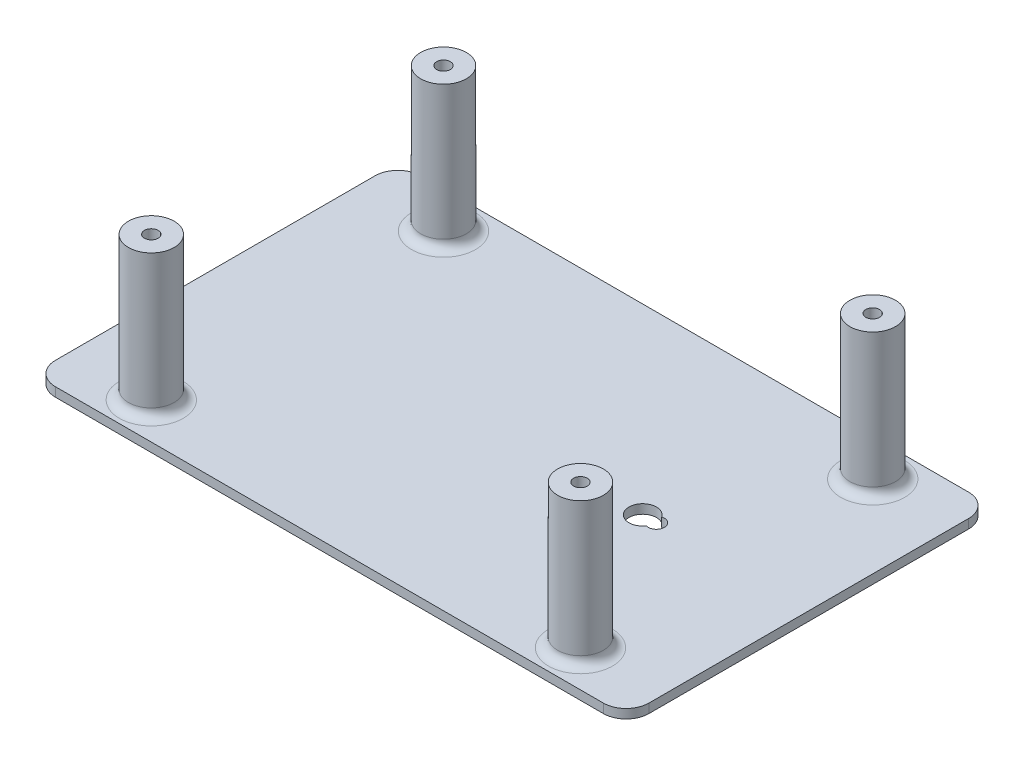
ISO-10303-21;
HEADER;
FILE_DESCRIPTION(('STEP AP214'),'2;1');
FILE_NAME('part.step','',(''),(''),'','','');
FILE_SCHEMA(('AUTOMOTIVE_DESIGN { 1 0 10303 214 1 1 1 1 }'));
ENDSEC;
DATA;
#1=APPLICATION_CONTEXT('core data for automotive mechanical design processes');
#2=APPLICATION_PROTOCOL_DEFINITION('international standard','automotive_design',2000,#1);
#3=PRODUCT_CONTEXT('',#1,'mechanical');
#4=PRODUCT('Part','Part','',(#3));
#5=PRODUCT_RELATED_PRODUCT_CATEGORY('part','',(#4));
#6=PRODUCT_DEFINITION_FORMATION('','',#4);
#7=PRODUCT_DEFINITION_CONTEXT('part definition',#1,'design');
#8=PRODUCT_DEFINITION('design','',#6,#7);
#9=PRODUCT_DEFINITION_SHAPE('','',#8);
#10=(LENGTH_UNIT() NAMED_UNIT(*) SI_UNIT(.MILLI.,.METRE.));
#11=(NAMED_UNIT(*) PLANE_ANGLE_UNIT() SI_UNIT($,.RADIAN.));
#12=(NAMED_UNIT(*) SI_UNIT($,.STERADIAN.) SOLID_ANGLE_UNIT());
#13=UNCERTAINTY_MEASURE_WITH_UNIT(LENGTH_MEASURE(1.E-05),#10,'distance_accuracy_value','');
#14=(GEOMETRIC_REPRESENTATION_CONTEXT(3) GLOBAL_UNCERTAINTY_ASSIGNED_CONTEXT((#13)) GLOBAL_UNIT_ASSIGNED_CONTEXT((#10,
#11,#12)) REPRESENTATION_CONTEXT('',''));
#15=CARTESIAN_POINT('',(0.,0.,0.));
#16=DIRECTION('',(0.,0.,1.));
#17=DIRECTION('',(1.,0.,0.));
#18=AXIS2_PLACEMENT_3D('',#15,#16,#17);
#19=CARTESIAN_POINT('',(-46.9999999999968,0.,32.0000000000053));
#20=DIRECTION('',(0.,1.,0.));
#21=DIRECTION('',(0.,0.,1.));
#22=AXIS2_PLACEMENT_3D('',#19,#20,#21);
#23=CYLINDRICAL_SURFACE('',#22,3.25);
#24=CARTESIAN_POINT('',(-46.9999999999968,2.,32.0000000000053));
#25=DIRECTION('',(0.,-1.,0.));
#26=DIRECTION('',(0.,0.,-1.));
#27=AXIS2_PLACEMENT_3D('',#24,#25,#26);
#28=CIRCLE('',#27,3.25);
#29=CARTESIAN_POINT('',(-46.9999999999968,2.,28.7500000000053));
#30=VERTEX_POINT('',#29);
#31=EDGE_CURVE('E273',#30,#30,#28,.T.);
#32=ORIENTED_EDGE('',*,*,#31,.T.);
#33=EDGE_LOOP('',(#32));
#34=FACE_BOUND('',#33,.T.);
#35=CARTESIAN_POINT('',(-46.9999999999968,18.4,32.0000000000053));
#36=DIRECTION('',(0.,1.,0.));
#37=DIRECTION('',(0.,0.,1.));
#38=AXIS2_PLACEMENT_3D('',#35,#36,#37);
#39=CIRCLE('',#38,3.25);
#40=CARTESIAN_POINT('',(-46.9999999999968,18.4,35.2500000000053));
#41=VERTEX_POINT('',#40);
#42=EDGE_CURVE('E255',#41,#41,#39,.F.);
#43=ORIENTED_EDGE('',*,*,#42,.F.);
#44=EDGE_LOOP('',(#43));
#45=FACE_BOUND('',#44,.T.);
#46=ADVANCED_FACE('F34',(#34,#45),#23,.F.);
#47=CARTESIAN_POINT('',(47.0000000000003,0.,32.0000000000053));
#48=DIRECTION('',(0.,1.,0.));
#49=DIRECTION('',(0.,0.,1.));
#50=AXIS2_PLACEMENT_3D('',#47,#48,#49);
#51=CYLINDRICAL_SURFACE('',#50,3.25);
#52=CARTESIAN_POINT('',(47.0000000000003,2.,32.0000000000053));
#53=DIRECTION('',(0.,-1.,0.));
#54=DIRECTION('',(0.,0.,-1.));
#55=AXIS2_PLACEMENT_3D('',#52,#53,#54);
#56=CIRCLE('',#55,3.25);
#57=CARTESIAN_POINT('',(47.0000000000003,2.,28.7500000000053));
#58=VERTEX_POINT('',#57);
#59=EDGE_CURVE('E270',#58,#58,#56,.T.);
#60=ORIENTED_EDGE('',*,*,#59,.T.);
#61=EDGE_LOOP('',(#60));
#62=FACE_BOUND('',#61,.T.);
#63=CARTESIAN_POINT('',(47.0000000000003,18.4,32.0000000000053));
#64=DIRECTION('',(0.,1.,0.));
#65=DIRECTION('',(0.,0.,1.));
#66=AXIS2_PLACEMENT_3D('',#63,#64,#65);
#67=CIRCLE('',#66,3.25);
#68=CARTESIAN_POINT('',(47.0000000000003,18.4,35.2500000000053));
#69=VERTEX_POINT('',#68);
#70=EDGE_CURVE('E252',#69,#69,#67,.F.);
#71=ORIENTED_EDGE('',*,*,#70,.F.);
#72=EDGE_LOOP('',(#71));
#73=FACE_BOUND('',#72,.T.);
#74=ADVANCED_FACE('F346',(#62,#73),#51,.F.);
#75=CARTESIAN_POINT('',(47.0000000000003,0.,-32.0000000000053));
#76=DIRECTION('',(0.,1.,0.));
#77=DIRECTION('',(0.,0.,1.));
#78=AXIS2_PLACEMENT_3D('',#75,#76,#77);
#79=CYLINDRICAL_SURFACE('',#78,3.25);
#80=CARTESIAN_POINT('',(47.0000000000003,2.,-32.0000000000053));
#81=DIRECTION('',(0.,-1.,0.));
#82=DIRECTION('',(0.,0.,-1.));
#83=AXIS2_PLACEMENT_3D('',#80,#81,#82);
#84=CIRCLE('',#83,3.25);
#85=CARTESIAN_POINT('',(47.0000000000003,2.,-35.2500000000053));
#86=VERTEX_POINT('',#85);
#87=EDGE_CURVE('E11',#86,#86,#84,.T.);
#88=ORIENTED_EDGE('',*,*,#87,.T.);
#89=EDGE_LOOP('',(#88));
#90=FACE_BOUND('',#89,.T.);
#91=CARTESIAN_POINT('',(47.0000000000003,18.4,-32.0000000000053));
#92=DIRECTION('',(0.,1.,0.));
#93=DIRECTION('',(0.,0.,1.));
#94=AXIS2_PLACEMENT_3D('',#91,#92,#93);
#95=CIRCLE('',#94,3.25);
#96=CARTESIAN_POINT('',(47.0000000000003,18.4,-28.7500000000053));
#97=VERTEX_POINT('',#96);
#98=EDGE_CURVE('E249',#97,#97,#95,.F.);
#99=ORIENTED_EDGE('',*,*,#98,.F.);
#100=EDGE_LOOP('',(#99));
#101=FACE_BOUND('',#100,.T.);
#102=ADVANCED_FACE('F342',(#90,#101),#79,.F.);
#103=CARTESIAN_POINT('',(-46.9999999999968,0.,-32.0000000000053));
#104=DIRECTION('',(0.,1.,0.));
#105=DIRECTION('',(0.,0.,1.));
#106=AXIS2_PLACEMENT_3D('',#103,#104,#105);
#107=CYLINDRICAL_SURFACE('',#106,3.25);
#108=CARTESIAN_POINT('',(-46.9999999999968,2.,-32.0000000000053));
#109=DIRECTION('',(0.,-1.,0.));
#110=DIRECTION('',(0.,0.,-1.));
#111=AXIS2_PLACEMENT_3D('',#108,#109,#110);
#112=CIRCLE('',#111,3.25);
#113=CARTESIAN_POINT('',(-46.9999999999968,2.,-35.2500000000053));
#114=VERTEX_POINT('',#113);
#115=EDGE_CURVE('E42',#114,#114,#112,.T.);
#116=ORIENTED_EDGE('',*,*,#115,.T.);
#117=EDGE_LOOP('',(#116));
#118=FACE_BOUND('',#117,.T.);
#119=CARTESIAN_POINT('',(-46.9999999999968,18.4,-32.0000000000053));
#120=DIRECTION('',(0.,1.,0.));
#121=DIRECTION('',(0.,0.,1.));
#122=AXIS2_PLACEMENT_3D('',#119,#120,#121);
#123=CIRCLE('',#122,3.25);
#124=CARTESIAN_POINT('',(-46.9999999999968,18.4,-28.7500000000053));
#125=VERTEX_POINT('',#124);
#126=EDGE_CURVE('E246',#125,#125,#123,.F.);
#127=ORIENTED_EDGE('',*,*,#126,.F.);
#128=EDGE_LOOP('',(#127));
#129=FACE_BOUND('',#128,.T.);
#130=ADVANCED_FACE('F278',(#118,#129),#107,.F.);
#131=CARTESIAN_POINT('',(60.0000000000006,2.,-34.999999999996));
#132=DIRECTION('',(0.,-1.,0.));
#133=DIRECTION('',(0.,0.,-1.));
#134=AXIS2_PLACEMENT_3D('',#131,#132,#133);
#135=PLANE('',#134);
#136=CARTESIAN_POINT('',(28.6224498233947,2.,0.));
#137=DIRECTION('',(0.,-1.,0.));
#138=DIRECTION('',(0.,0.,-1.));
#139=AXIS2_PLACEMENT_3D('',#136,#137,#138);
#140=CIRCLE('',#139,3.);
#141=CARTESIAN_POINT('',(31.112033156728,2.,1.67391004130715));
#142=VERTEX_POINT('',#141);
#143=CARTESIAN_POINT('',(31.112033156728,2.,-1.67391004130715));
#144=VERTEX_POINT('',#143);
#145=EDGE_CURVE('E113',#142,#144,#140,.T.);
#146=ORIENTED_EDGE('',*,*,#145,.T.);
#147=CARTESIAN_POINT('',(31.6224498233947,2.,0.));
#148=DIRECTION('',(0.,-1.,0.));
#149=DIRECTION('',(0.,0.,-1.));
#150=AXIS2_PLACEMENT_3D('',#147,#148,#149);
#151=CIRCLE('',#150,1.75);
#152=EDGE_CURVE('E111',#144,#142,#151,.T.);
#153=ORIENTED_EDGE('',*,*,#152,.T.);
#154=EDGE_LOOP('',(#146,#153));
#155=FACE_BOUND('',#154,.T.);
#156=CARTESIAN_POINT('',(-46.9999999999968,2.,32.0000000000053));
#157=DIRECTION('',(0.,-1.,0.));
#158=DIRECTION('',(0.,0.,-1.));
#159=AXIS2_PLACEMENT_3D('',#156,#157,#158);
#160=CIRCLE('',#159,7.);
#161=CARTESIAN_POINT('',(-46.9999999999968,2.,25.0000000000053));
#162=VERTEX_POINT('',#161);
#163=EDGE_CURVE('E234',#162,#162,#160,.T.);
#164=ORIENTED_EDGE('',*,*,#163,.T.);
#165=EDGE_LOOP('',(#164));
#166=FACE_BOUND('',#165,.T.);
#167=CARTESIAN_POINT('',(47.0000000000003,2.,32.0000000000053));
#168=DIRECTION('',(0.,-1.,0.));
#169=DIRECTION('',(0.,0.,-1.));
#170=AXIS2_PLACEMENT_3D('',#167,#168,#169);
#171=CIRCLE('',#170,7.);
#172=CARTESIAN_POINT('',(47.0000000000003,2.,25.0000000000053));
#173=VERTEX_POINT('',#172);
#174=EDGE_CURVE('E231',#173,#173,#171,.T.);
#175=ORIENTED_EDGE('',*,*,#174,.T.);
#176=EDGE_LOOP('',(#175));
#177=FACE_BOUND('',#176,.T.);
#178=CARTESIAN_POINT('',(47.0000000000003,2.,-32.0000000000053));
#179=DIRECTION('',(0.,-1.,0.));
#180=DIRECTION('',(0.,0.,-1.));
#181=AXIS2_PLACEMENT_3D('',#178,#179,#180);
#182=CIRCLE('',#181,7.);
#183=CARTESIAN_POINT('',(47.0000000000003,2.,-39.0000000000053));
#184=VERTEX_POINT('',#183);
#185=EDGE_CURVE('E228',#184,#184,#182,.T.);
#186=ORIENTED_EDGE('',*,*,#185,.T.);
#187=EDGE_LOOP('',(#186));
#188=FACE_BOUND('',#187,.T.);
#189=CARTESIAN_POINT('',(-46.9999999999968,2.,-32.0000000000053));
#190=DIRECTION('',(0.,-1.,0.));
#191=DIRECTION('',(0.,0.,-1.));
#192=AXIS2_PLACEMENT_3D('',#189,#190,#191);
#193=CIRCLE('',#192,7.);
#194=CARTESIAN_POINT('',(-46.9999999999968,2.,-39.0000000000053));
#195=VERTEX_POINT('',#194);
#196=EDGE_CURVE('E225',#195,#195,#193,.T.);
#197=ORIENTED_EDGE('',*,*,#196,.T.);
#198=EDGE_LOOP('',(#197));
#199=FACE_BOUND('',#198,.T.);
#200=CARTESIAN_POINT('',(60.0000000000006,2.,-34.999999999996));
#201=DIRECTION('',(0.,1.,0.));
#202=DIRECTION('',(0.,0.,-1.));
#203=AXIS2_PLACEMENT_3D('',#200,#201,#202);
#204=CIRCLE('',#203,5.);
#205=CARTESIAN_POINT('',(65.0000000000006,2.,-34.999999999996));
#206=VERTEX_POINT('',#205);
#207=CARTESIAN_POINT('',(60.0000000000006,2.,-39.999999999996));
#208=VERTEX_POINT('',#207);
#209=EDGE_CURVE('E165',#206,#208,#204,.T.);
#210=ORIENTED_EDGE('',*,*,#209,.T.);
#211=DIRECTION('',(-1.,0.,0.));
#212=VECTOR('',#211,1.);
#213=CARTESIAN_POINT('',(-59.9999999999971,2.,-39.999999999996));
#214=LINE('',#213,#212);
#215=CARTESIAN_POINT('',(-59.9999999999971,2.,-39.999999999996));
#216=VERTEX_POINT('',#215);
#217=EDGE_CURVE('E168',#208,#216,#214,.T.);
#218=ORIENTED_EDGE('',*,*,#217,.T.);
#219=CARTESIAN_POINT('',(-59.9999999999971,2.,-34.999999999996));
#220=DIRECTION('',(0.,1.,0.));
#221=DIRECTION('',(0.,0.,1.));
#222=AXIS2_PLACEMENT_3D('',#219,#220,#221);
#223=CIRCLE('',#222,5.);
#224=CARTESIAN_POINT('',(-64.9999999999971,2.,-34.999999999996));
#225=VERTEX_POINT('',#224);
#226=EDGE_CURVE('E171',#216,#225,#223,.T.);
#227=ORIENTED_EDGE('',*,*,#226,.T.);
#228=DIRECTION('',(0.,0.,1.));
#229=VECTOR('',#228,1.);
#230=CARTESIAN_POINT('',(-64.9999999999971,2.,34.999999999996));
#231=LINE('',#230,#229);
#232=CARTESIAN_POINT('',(-64.9999999999971,2.,34.999999999996));
#233=VERTEX_POINT('',#232);
#234=EDGE_CURVE('E173',#225,#233,#231,.T.);
#235=ORIENTED_EDGE('',*,*,#234,.T.);
#236=CARTESIAN_POINT('',(-59.9999999999971,2.,34.999999999996));
#237=DIRECTION('',(0.,1.,0.));
#238=DIRECTION('',(0.,0.,-1.));
#239=AXIS2_PLACEMENT_3D('',#236,#237,#238);
#240=CIRCLE('',#239,5.);
#241=CARTESIAN_POINT('',(-59.9999999999971,2.,39.999999999996));
#242=VERTEX_POINT('',#241);
#243=EDGE_CURVE('E175',#233,#242,#240,.T.);
#244=ORIENTED_EDGE('',*,*,#243,.T.);
#245=DIRECTION('',(1.,0.,0.));
#246=VECTOR('',#245,1.);
#247=CARTESIAN_POINT('',(60.0000000000006,2.,39.999999999996));
#248=LINE('',#247,#246);
#249=CARTESIAN_POINT('',(60.0000000000006,2.,39.999999999996));
#250=VERTEX_POINT('',#249);
#251=EDGE_CURVE('E177',#242,#250,#248,.T.);
#252=ORIENTED_EDGE('',*,*,#251,.T.);
#253=CARTESIAN_POINT('',(60.0000000000006,2.,34.999999999996));
#254=DIRECTION('',(0.,1.,0.));
#255=DIRECTION('',(0.,0.,-1.));
#256=AXIS2_PLACEMENT_3D('',#253,#254,#255);
#257=CIRCLE('',#256,5.);
#258=CARTESIAN_POINT('',(65.0000000000006,2.,34.999999999996));
#259=VERTEX_POINT('',#258);
#260=EDGE_CURVE('E179',#250,#259,#257,.T.);
#261=ORIENTED_EDGE('',*,*,#260,.T.);
#262=DIRECTION('',(0.,0.,-1.));
#263=VECTOR('',#262,1.);
#264=CARTESIAN_POINT('',(65.0000000000006,2.,-34.999999999996));
#265=LINE('',#264,#263);
#266=EDGE_CURVE('E181',#259,#206,#265,.T.);
#267=ORIENTED_EDGE('',*,*,#266,.T.);
#268=EDGE_LOOP('',(#210,#218,#227,#235,#244,#252,#261,#267));
#269=FACE_BOUND('',#268,.T.);
#270=ADVANCED_FACE('F332',(#155,#166,#177,#188,#199,#269),#135,.F.);
#271=CARTESIAN_POINT('',(60.0000000000006,2.,-34.999999999996));
#272=DIRECTION('',(0.,-1.,0.));
#273=DIRECTION('',(0.,0.,-1.));
#274=AXIS2_PLACEMENT_3D('',#271,#272,#273);
#275=CYLINDRICAL_SURFACE('',#274,5.);
#276=CARTESIAN_POINT('',(60.0000000000006,0.,-34.999999999996));
#277=DIRECTION('',(0.,1.,0.));
#278=DIRECTION('',(0.,0.,-1.));
#279=AXIS2_PLACEMENT_3D('',#276,#277,#278);
#280=CIRCLE('',#279,5.);
#281=CARTESIAN_POINT('',(65.0000000000006,0.,-34.999999999996));
#282=VERTEX_POINT('',#281);
#283=CARTESIAN_POINT('',(60.0000000000006,0.,-39.999999999996));
#284=VERTEX_POINT('',#283);
#285=EDGE_CURVE('E164',#282,#284,#280,.T.);
#286=ORIENTED_EDGE('',*,*,#285,.T.);
#287=DIRECTION('',(0.,-1.,0.));
#288=VECTOR('',#287,1.);
#289=CARTESIAN_POINT('',(60.0000000000006,2.,-39.999999999996));
#290=LINE('',#289,#288);
#291=EDGE_CURVE('E219',#208,#284,#290,.T.);
#292=ORIENTED_EDGE('',*,*,#291,.F.);
#293=ORIENTED_EDGE('',*,*,#209,.F.);
#294=DIRECTION('',(0.,-1.,0.));
#295=VECTOR('',#294,1.);
#296=CARTESIAN_POINT('',(65.0000000000006,2.,-34.999999999996));
#297=LINE('',#296,#295);
#298=EDGE_CURVE('E183',#206,#282,#297,.T.);
#299=ORIENTED_EDGE('',*,*,#298,.T.);
#300=EDGE_LOOP('',(#286,#292,#293,#299));
#301=FACE_BOUND('',#300,.T.);
#302=ADVANCED_FACE('F300',(#301),#275,.T.);
#303=CARTESIAN_POINT('',(-59.9999999999971,2.,-39.999999999996));
#304=DIRECTION('',(0.,0.,1.));
#305=DIRECTION('',(1.,0.,0.));
#306=AXIS2_PLACEMENT_3D('',#303,#304,#305);
#307=PLANE('',#306);
#308=DIRECTION('',(-1.,0.,0.));
#309=VECTOR('',#308,1.);
#310=CARTESIAN_POINT('',(-59.9999999999971,0.,-39.999999999996));
#311=LINE('',#310,#309);
#312=CARTESIAN_POINT('',(-59.9999999999971,0.,-39.999999999996));
#313=VERTEX_POINT('',#312);
#314=EDGE_CURVE('E186',#284,#313,#311,.T.);
#315=ORIENTED_EDGE('',*,*,#314,.T.);
#316=DIRECTION('',(0.,-1.,0.));
#317=VECTOR('',#316,1.);
#318=CARTESIAN_POINT('',(-59.9999999999971,2.,-39.999999999996));
#319=LINE('',#318,#317);
#320=EDGE_CURVE('E216',#216,#313,#319,.T.);
#321=ORIENTED_EDGE('',*,*,#320,.F.);
#322=ORIENTED_EDGE('',*,*,#217,.F.);
#323=ORIENTED_EDGE('',*,*,#291,.T.);
#324=EDGE_LOOP('',(#315,#321,#322,#323));
#325=FACE_BOUND('',#324,.T.);
#326=ADVANCED_FACE('F330',(#325),#307,.F.);
#327=CARTESIAN_POINT('',(-59.9999999999971,2.,-34.999999999996));
#328=DIRECTION('',(0.,-1.,0.));
#329=DIRECTION('',(0.,0.,-1.));
#330=AXIS2_PLACEMENT_3D('',#327,#328,#329);
#331=CYLINDRICAL_SURFACE('',#330,5.);
#332=CARTESIAN_POINT('',(-59.9999999999971,0.,-34.999999999996));
#333=DIRECTION('',(0.,1.,0.));
#334=DIRECTION('',(0.,0.,1.));
#335=AXIS2_PLACEMENT_3D('',#332,#333,#334);
#336=CIRCLE('',#335,5.);
#337=CARTESIAN_POINT('',(-64.9999999999971,0.,-34.999999999996));
#338=VERTEX_POINT('',#337);
#339=EDGE_CURVE('E188',#313,#338,#336,.T.);
#340=ORIENTED_EDGE('',*,*,#339,.T.);
#341=DIRECTION('',(0.,-1.,0.));
#342=VECTOR('',#341,1.);
#343=CARTESIAN_POINT('',(-64.9999999999971,2.,-34.999999999996));
#344=LINE('',#343,#342);
#345=EDGE_CURVE('E213',#225,#338,#344,.T.);
#346=ORIENTED_EDGE('',*,*,#345,.F.);
#347=ORIENTED_EDGE('',*,*,#226,.F.);
#348=ORIENTED_EDGE('',*,*,#320,.T.);
#349=EDGE_LOOP('',(#340,#346,#347,#348));
#350=FACE_BOUND('',#349,.T.);
#351=ADVANCED_FACE('F326',(#350),#331,.T.);
#352=CARTESIAN_POINT('',(-64.9999999999971,2.,34.999999999996));
#353=DIRECTION('',(1.,0.,0.));
#354=DIRECTION('',(0.,0.,-1.));
#355=AXIS2_PLACEMENT_3D('',#352,#353,#354);
#356=PLANE('',#355);
#357=DIRECTION('',(0.,0.,1.));
#358=VECTOR('',#357,1.);
#359=CARTESIAN_POINT('',(-64.9999999999971,0.,34.999999999996));
#360=LINE('',#359,#358);
#361=CARTESIAN_POINT('',(-64.9999999999971,0.,34.999999999996));
#362=VERTEX_POINT('',#361);
#363=EDGE_CURVE('E190',#338,#362,#360,.T.);
#364=ORIENTED_EDGE('',*,*,#363,.T.);
#365=DIRECTION('',(0.,-1.,0.));
#366=VECTOR('',#365,1.);
#367=CARTESIAN_POINT('',(-64.9999999999971,2.,34.999999999996));
#368=LINE('',#367,#366);
#369=EDGE_CURVE('E210',#233,#362,#368,.T.);
#370=ORIENTED_EDGE('',*,*,#369,.F.);
#371=ORIENTED_EDGE('',*,*,#234,.F.);
#372=ORIENTED_EDGE('',*,*,#345,.T.);
#373=EDGE_LOOP('',(#364,#370,#371,#372));
#374=FACE_BOUND('',#373,.T.);
#375=ADVANCED_FACE('F323',(#374),#356,.F.);
#376=CARTESIAN_POINT('',(-59.9999999999971,2.,34.999999999996));
#377=DIRECTION('',(0.,-1.,0.));
#378=DIRECTION('',(0.,0.,-1.));
#379=AXIS2_PLACEMENT_3D('',#376,#377,#378);
#380=CYLINDRICAL_SURFACE('',#379,5.);
#381=CARTESIAN_POINT('',(-59.9999999999971,0.,34.999999999996));
#382=DIRECTION('',(0.,1.,0.));
#383=DIRECTION('',(0.,0.,-1.));
#384=AXIS2_PLACEMENT_3D('',#381,#382,#383);
#385=CIRCLE('',#384,5.);
#386=CARTESIAN_POINT('',(-59.9999999999971,0.,39.999999999996));
#387=VERTEX_POINT('',#386);
#388=EDGE_CURVE('E192',#362,#387,#385,.T.);
#389=ORIENTED_EDGE('',*,*,#388,.T.);
#390=DIRECTION('',(0.,-1.,0.));
#391=VECTOR('',#390,1.);
#392=CARTESIAN_POINT('',(-59.9999999999971,2.,39.999999999996));
#393=LINE('',#392,#391);
#394=EDGE_CURVE('E207',#242,#387,#393,.T.);
#395=ORIENTED_EDGE('',*,*,#394,.F.);
#396=ORIENTED_EDGE('',*,*,#243,.F.);
#397=ORIENTED_EDGE('',*,*,#369,.T.);
#398=EDGE_LOOP('',(#389,#395,#396,#397));
#399=FACE_BOUND('',#398,.T.);
#400=ADVANCED_FACE('F319',(#399),#380,.T.);
#401=CARTESIAN_POINT('',(60.0000000000006,2.,39.999999999996));
#402=DIRECTION('',(0.,0.,-1.));
#403=DIRECTION('',(-1.,0.,0.));
#404=AXIS2_PLACEMENT_3D('',#401,#402,#403);
#405=PLANE('',#404);
#406=DIRECTION('',(1.,0.,0.));
#407=VECTOR('',#406,1.);
#408=CARTESIAN_POINT('',(60.0000000000006,0.,39.999999999996));
#409=LINE('',#408,#407);
#410=CARTESIAN_POINT('',(60.0000000000006,0.,39.999999999996));
#411=VERTEX_POINT('',#410);
#412=EDGE_CURVE('E194',#387,#411,#409,.T.);
#413=ORIENTED_EDGE('',*,*,#412,.T.);
#414=DIRECTION('',(0.,-1.,0.));
#415=VECTOR('',#414,1.);
#416=CARTESIAN_POINT('',(60.0000000000006,2.,39.999999999996));
#417=LINE('',#416,#415);
#418=EDGE_CURVE('E204',#250,#411,#417,.T.);
#419=ORIENTED_EDGE('',*,*,#418,.F.);
#420=ORIENTED_EDGE('',*,*,#251,.F.);
#421=ORIENTED_EDGE('',*,*,#394,.T.);
#422=EDGE_LOOP('',(#413,#419,#420,#421));
#423=FACE_BOUND('',#422,.T.);
#424=ADVANCED_FACE('F314',(#423),#405,.F.);
#425=CARTESIAN_POINT('',(60.0000000000006,2.,34.999999999996));
#426=DIRECTION('',(0.,-1.,0.));
#427=DIRECTION('',(0.,0.,-1.));
#428=AXIS2_PLACEMENT_3D('',#425,#426,#427);
#429=CYLINDRICAL_SURFACE('',#428,5.);
#430=CARTESIAN_POINT('',(60.0000000000006,0.,34.999999999996));
#431=DIRECTION('',(0.,1.,0.));
#432=DIRECTION('',(0.,0.,-1.));
#433=AXIS2_PLACEMENT_3D('',#430,#431,#432);
#434=CIRCLE('',#433,5.);
#435=CARTESIAN_POINT('',(65.0000000000006,0.,34.999999999996));
#436=VERTEX_POINT('',#435);
#437=EDGE_CURVE('E196',#411,#436,#434,.T.);
#438=ORIENTED_EDGE('',*,*,#437,.T.);
#439=DIRECTION('',(0.,-1.,0.));
#440=VECTOR('',#439,1.);
#441=CARTESIAN_POINT('',(65.0000000000006,2.,34.999999999996));
#442=LINE('',#441,#440);
#443=EDGE_CURVE('E201',#259,#436,#442,.T.);
#444=ORIENTED_EDGE('',*,*,#443,.F.);
#445=ORIENTED_EDGE('',*,*,#260,.F.);
#446=ORIENTED_EDGE('',*,*,#418,.T.);
#447=EDGE_LOOP('',(#438,#444,#445,#446));
#448=FACE_BOUND('',#447,.T.);
#449=ADVANCED_FACE('F308',(#448),#429,.T.);
#450=CARTESIAN_POINT('',(65.0000000000006,2.,-34.999999999996));
#451=DIRECTION('',(-1.,0.,0.));
#452=DIRECTION('',(0.,0.,1.));
#453=AXIS2_PLACEMENT_3D('',#450,#451,#452);
#454=PLANE('',#453);
#455=DIRECTION('',(0.,0.,-1.));
#456=VECTOR('',#455,1.);
#457=CARTESIAN_POINT('',(65.0000000000006,0.,-34.999999999996));
#458=LINE('',#457,#456);
#459=EDGE_CURVE('E169',#436,#282,#458,.T.);
#460=ORIENTED_EDGE('',*,*,#459,.T.);
#461=ORIENTED_EDGE('',*,*,#298,.F.);
#462=ORIENTED_EDGE('',*,*,#266,.F.);
#463=ORIENTED_EDGE('',*,*,#443,.T.);
#464=EDGE_LOOP('',(#460,#461,#462,#463));
#465=FACE_BOUND('',#464,.T.);
#466=ADVANCED_FACE('F290',(#465),#454,.F.);
#467=CARTESIAN_POINT('',(60.0000000000006,0.,-34.999999999996));
#468=DIRECTION('',(0.,-1.,0.));
#469=DIRECTION('',(0.,0.,-1.));
#470=AXIS2_PLACEMENT_3D('',#467,#468,#469);
#471=PLANE('',#470);
#472=CARTESIAN_POINT('',(31.6224498233947,0.,0.));
#473=DIRECTION('',(0.,-1.,0.));
#474=DIRECTION('',(0.,0.,-1.));
#475=AXIS2_PLACEMENT_3D('',#472,#473,#474);
#476=CIRCLE('',#475,1.75);
#477=CARTESIAN_POINT('',(31.112033156728,0.,-1.67391004130715));
#478=VERTEX_POINT('',#477);
#479=CARTESIAN_POINT('',(31.112033156728,0.,1.67391004130715));
#480=VERTEX_POINT('',#479);
#481=EDGE_CURVE('E56',#478,#480,#476,.T.);
#482=ORIENTED_EDGE('',*,*,#481,.F.);
#483=CARTESIAN_POINT('',(28.6224498233947,0.,0.));
#484=DIRECTION('',(0.,-1.,0.));
#485=DIRECTION('',(0.,0.,-1.));
#486=AXIS2_PLACEMENT_3D('',#483,#484,#485);
#487=CIRCLE('',#486,3.);
#488=EDGE_CURVE('E117',#480,#478,#487,.T.);
#489=ORIENTED_EDGE('',*,*,#488,.F.);
#490=EDGE_LOOP('',(#482,#489));
#491=FACE_BOUND('',#490,.T.);
#492=CARTESIAN_POINT('',(47.0000000000003,0.,32.0000000000053));
#493=DIRECTION('',(0.,-1.,0.));
#494=DIRECTION('',(0.,0.,-1.));
#495=AXIS2_PLACEMENT_3D('',#492,#493,#494);
#496=CIRCLE('',#495,5.25);
#497=CARTESIAN_POINT('',(47.0000000000003,0.,26.7500000000053));
#498=VERTEX_POINT('',#497);
#499=EDGE_CURVE('E267',#498,#498,#496,.F.);
#500=ORIENTED_EDGE('',*,*,#499,.T.);
#501=EDGE_LOOP('',(#500));
#502=FACE_BOUND('',#501,.T.);
#503=CARTESIAN_POINT('',(-46.9999999999968,0.,32.0000000000053));
#504=DIRECTION('',(0.,-1.,0.));
#505=DIRECTION('',(0.,0.,-1.));
#506=AXIS2_PLACEMENT_3D('',#503,#504,#505);
#507=CIRCLE('',#506,5.25);
#508=CARTESIAN_POINT('',(-46.9999999999968,0.,26.7500000000053));
#509=VERTEX_POINT('',#508);
#510=EDGE_CURVE('E264',#509,#509,#507,.F.);
#511=ORIENTED_EDGE('',*,*,#510,.T.);
#512=EDGE_LOOP('',(#511));
#513=FACE_BOUND('',#512,.T.);
#514=CARTESIAN_POINT('',(-46.9999999999968,0.,-32.0000000000053));
#515=DIRECTION('',(0.,-1.,0.));
#516=DIRECTION('',(0.,0.,-1.));
#517=AXIS2_PLACEMENT_3D('',#514,#515,#516);
#518=CIRCLE('',#517,5.25);
#519=CARTESIAN_POINT('',(-46.9999999999968,0.,-37.2500000000054));
#520=VERTEX_POINT('',#519);
#521=EDGE_CURVE('E261',#520,#520,#518,.F.);
#522=ORIENTED_EDGE('',*,*,#521,.T.);
#523=EDGE_LOOP('',(#522));
#524=FACE_BOUND('',#523,.T.);
#525=CARTESIAN_POINT('',(47.0000000000003,0.,-32.0000000000053));
#526=DIRECTION('',(0.,-1.,0.));
#527=DIRECTION('',(0.,0.,-1.));
#528=AXIS2_PLACEMENT_3D('',#525,#526,#527);
#529=CIRCLE('',#528,5.25);
#530=CARTESIAN_POINT('',(47.0000000000003,0.,-37.2500000000054));
#531=VERTEX_POINT('',#530);
#532=EDGE_CURVE('E258',#531,#531,#529,.F.);
#533=ORIENTED_EDGE('',*,*,#532,.T.);
#534=EDGE_LOOP('',(#533));
#535=FACE_BOUND('',#534,.T.);
#536=ORIENTED_EDGE('',*,*,#285,.F.);
#537=ORIENTED_EDGE('',*,*,#459,.F.);
#538=ORIENTED_EDGE('',*,*,#437,.F.);
#539=ORIENTED_EDGE('',*,*,#412,.F.);
#540=ORIENTED_EDGE('',*,*,#388,.F.);
#541=ORIENTED_EDGE('',*,*,#363,.F.);
#542=ORIENTED_EDGE('',*,*,#339,.F.);
#543=ORIENTED_EDGE('',*,*,#314,.F.);
#544=EDGE_LOOP('',(#536,#537,#538,#539,#540,#541,#542,#543));
#545=FACE_BOUND('',#544,.T.);
#546=ADVANCED_FACE('F121',(#491,#502,#513,#524,#535,#545),#471,.T.);
#547=CARTESIAN_POINT('',(-46.9999999999968,33.4,-32.0000000000053));
#548=DIRECTION('',(0.,1.,0.));
#549=DIRECTION('',(0.,0.,1.));
#550=AXIS2_PLACEMENT_3D('',#547,#548,#549);
#551=PLANE('',#550);
#552=CARTESIAN_POINT('',(-46.9999999999968,33.4,-32.0000000000053));
#553=DIRECTION('',(0.,1.,0.));
#554=DIRECTION('',(0.,0.,1.));
#555=AXIS2_PLACEMENT_3D('',#552,#553,#554);
#556=CIRCLE('',#555,5.);
#557=CARTESIAN_POINT('',(-46.9999999999968,33.4,-27.0000000000053));
#558=VERTEX_POINT('',#557);
#559=EDGE_CURVE('E161',#558,#558,#556,.T.);
#560=ORIENTED_EDGE('',*,*,#559,.T.);
#561=EDGE_LOOP('',(#560));
#562=FACE_BOUND('',#561,.T.);
#563=CARTESIAN_POINT('',(-46.9999999999968,33.4,-32.0000000000053));
#564=DIRECTION('',(0.,1.,0.));
#565=DIRECTION('',(0.,0.,1.));
#566=AXIS2_PLACEMENT_3D('',#563,#564,#565);
#567=CIRCLE('',#566,1.5);
#568=CARTESIAN_POINT('',(-46.9999999999968,33.4,-30.5000000000053));
#569=VERTEX_POINT('',#568);
#570=EDGE_CURVE('E144',#569,#569,#567,.T.);
#571=ORIENTED_EDGE('',*,*,#570,.F.);
#572=EDGE_LOOP('',(#571));
#573=FACE_BOUND('',#572,.T.);
#574=ADVANCED_FACE('F289',(#562,#573),#551,.T.);
#575=CARTESIAN_POINT('',(-46.9999999999968,33.4,-32.0000000000053));
#576=DIRECTION('',(0.,-1.,0.));
#577=DIRECTION('',(0.,0.,-1.));
#578=AXIS2_PLACEMENT_3D('',#575,#576,#577);
#579=CYLINDRICAL_SURFACE('',#578,5.);
#580=CARTESIAN_POINT('',(-46.9999999999968,4.,-32.0000000000053));
#581=DIRECTION('',(0.,-1.,0.));
#582=DIRECTION('',(0.,0.,-1.));
#583=AXIS2_PLACEMENT_3D('',#580,#581,#582);
#584=CIRCLE('',#583,5.);
#585=CARTESIAN_POINT('',(-46.9999999999968,4.,-37.0000000000053));
#586=VERTEX_POINT('',#585);
#587=EDGE_CURVE('E243',#586,#586,#584,.F.);
#588=ORIENTED_EDGE('',*,*,#587,.T.);
#589=EDGE_LOOP('',(#588));
#590=FACE_BOUND('',#589,.T.);
#591=ORIENTED_EDGE('',*,*,#559,.F.);
#592=EDGE_LOOP('',(#591));
#593=FACE_BOUND('',#592,.T.);
#594=ADVANCED_FACE('F359',(#590,#593),#579,.T.);
#595=CARTESIAN_POINT('',(47.0000000000003,33.4,32.0000000000053));
#596=DIRECTION('',(0.,1.,0.));
#597=DIRECTION('',(0.,0.,1.));
#598=AXIS2_PLACEMENT_3D('',#595,#596,#597);
#599=PLANE('',#598);
#600=CARTESIAN_POINT('',(47.0000000000003,33.4,32.0000000000053));
#601=DIRECTION('',(0.,1.,0.));
#602=DIRECTION('',(0.,0.,1.));
#603=AXIS2_PLACEMENT_3D('',#600,#601,#602);
#604=CIRCLE('',#603,5.);
#605=CARTESIAN_POINT('',(47.0000000000003,33.4,37.0000000000053));
#606=VERTEX_POINT('',#605);
#607=EDGE_CURVE('E158',#606,#606,#604,.T.);
#608=ORIENTED_EDGE('',*,*,#607,.T.);
#609=EDGE_LOOP('',(#608));
#610=FACE_BOUND('',#609,.T.);
#611=CARTESIAN_POINT('',(47.0000000000003,33.4,32.0000000000053));
#612=DIRECTION('',(0.,1.,0.));
#613=DIRECTION('',(0.,0.,1.));
#614=AXIS2_PLACEMENT_3D('',#611,#612,#613);
#615=CIRCLE('',#614,1.5);
#616=CARTESIAN_POINT('',(47.0000000000003,33.4,33.5000000000053));
#617=VERTEX_POINT('',#616);
#618=EDGE_CURVE('E132',#617,#617,#615,.T.);
#619=ORIENTED_EDGE('',*,*,#618,.F.);
#620=EDGE_LOOP('',(#619));
#621=FACE_BOUND('',#620,.T.);
#622=ADVANCED_FACE('F362',(#610,#621),#599,.T.);
#623=CARTESIAN_POINT('',(47.0000000000003,33.4,32.0000000000053));
#624=DIRECTION('',(0.,-1.,0.));
#625=DIRECTION('',(0.,0.,-1.));
#626=AXIS2_PLACEMENT_3D('',#623,#624,#625);
#627=CYLINDRICAL_SURFACE('',#626,5.);
#628=CARTESIAN_POINT('',(47.0000000000003,4.,32.0000000000053));
#629=DIRECTION('',(0.,-1.,0.));
#630=DIRECTION('',(0.,0.,-1.));
#631=AXIS2_PLACEMENT_3D('',#628,#629,#630);
#632=CIRCLE('',#631,5.);
#633=CARTESIAN_POINT('',(47.0000000000003,4.,27.0000000000053));
#634=VERTEX_POINT('',#633);
#635=EDGE_CURVE('E237',#634,#634,#632,.F.);
#636=ORIENTED_EDGE('',*,*,#635,.T.);
#637=EDGE_LOOP('',(#636));
#638=FACE_BOUND('',#637,.T.);
#639=ORIENTED_EDGE('',*,*,#607,.F.);
#640=EDGE_LOOP('',(#639));
#641=FACE_BOUND('',#640,.T.);
#642=ADVANCED_FACE('F367',(#638,#641),#627,.T.);
#643=CARTESIAN_POINT('',(47.0000000000003,33.4,-32.0000000000053));
#644=DIRECTION('',(0.,1.,0.));
#645=DIRECTION('',(0.,0.,1.));
#646=AXIS2_PLACEMENT_3D('',#643,#644,#645);
#647=PLANE('',#646);
#648=CARTESIAN_POINT('',(47.0000000000003,33.4,-32.0000000000053));
#649=DIRECTION('',(0.,1.,0.));
#650=DIRECTION('',(0.,0.,1.));
#651=AXIS2_PLACEMENT_3D('',#648,#649,#650);
#652=CIRCLE('',#651,5.);
#653=CARTESIAN_POINT('',(47.0000000000003,33.4,-27.0000000000053));
#654=VERTEX_POINT('',#653);
#655=EDGE_CURVE('E155',#654,#654,#652,.T.);
#656=ORIENTED_EDGE('',*,*,#655,.T.);
#657=EDGE_LOOP('',(#656));
#658=FACE_BOUND('',#657,.T.);
#659=CARTESIAN_POINT('',(47.0000000000003,33.4,-32.0000000000053));
#660=DIRECTION('',(0.,1.,0.));
#661=DIRECTION('',(0.,0.,1.));
#662=AXIS2_PLACEMENT_3D('',#659,#660,#661);
#663=CIRCLE('',#662,1.5);
#664=CARTESIAN_POINT('',(47.0000000000003,33.4,-30.5000000000053));
#665=VERTEX_POINT('',#664);
#666=EDGE_CURVE('E138',#665,#665,#663,.T.);
#667=ORIENTED_EDGE('',*,*,#666,.F.);
#668=EDGE_LOOP('',(#667));
#669=FACE_BOUND('',#668,.T.);
#670=ADVANCED_FACE('F370',(#658,#669),#647,.T.);
#671=CARTESIAN_POINT('',(47.0000000000003,33.4,-32.0000000000053));
#672=DIRECTION('',(0.,-1.,0.));
#673=DIRECTION('',(0.,0.,-1.));
#674=AXIS2_PLACEMENT_3D('',#671,#672,#673);
#675=CYLINDRICAL_SURFACE('',#674,5.);
#676=CARTESIAN_POINT('',(47.0000000000003,4.,-32.0000000000053));
#677=DIRECTION('',(0.,-1.,0.));
#678=DIRECTION('',(0.,0.,-1.));
#679=AXIS2_PLACEMENT_3D('',#676,#677,#678);
#680=CIRCLE('',#679,5.);
#681=CARTESIAN_POINT('',(47.0000000000003,4.,-37.0000000000053));
#682=VERTEX_POINT('',#681);
#683=EDGE_CURVE('E240',#682,#682,#680,.F.);
#684=ORIENTED_EDGE('',*,*,#683,.T.);
#685=EDGE_LOOP('',(#684));
#686=FACE_BOUND('',#685,.T.);
#687=ORIENTED_EDGE('',*,*,#655,.F.);
#688=EDGE_LOOP('',(#687));
#689=FACE_BOUND('',#688,.T.);
#690=ADVANCED_FACE('F375',(#686,#689),#675,.T.);
#691=CARTESIAN_POINT('',(-46.9999999999968,33.4,32.0000000000053));
#692=DIRECTION('',(0.,1.,0.));
#693=DIRECTION('',(0.,0.,1.));
#694=AXIS2_PLACEMENT_3D('',#691,#692,#693);
#695=PLANE('',#694);
#696=CARTESIAN_POINT('',(-46.9999999999968,33.4,32.0000000000053));
#697=DIRECTION('',(0.,1.,0.));
#698=DIRECTION('',(0.,0.,1.));
#699=AXIS2_PLACEMENT_3D('',#696,#697,#698);
#700=CIRCLE('',#699,5.);
#701=CARTESIAN_POINT('',(-46.9999999999968,33.4,37.0000000000053));
#702=VERTEX_POINT('',#701);
#703=EDGE_CURVE('E150',#702,#702,#700,.T.);
#704=ORIENTED_EDGE('',*,*,#703,.T.);
#705=EDGE_LOOP('',(#704));
#706=FACE_BOUND('',#705,.T.);
#707=CARTESIAN_POINT('',(-46.9999999999968,33.4,32.0000000000053));
#708=DIRECTION('',(0.,1.,0.));
#709=DIRECTION('',(0.,0.,1.));
#710=AXIS2_PLACEMENT_3D('',#707,#708,#709);
#711=CIRCLE('',#710,1.5);
#712=CARTESIAN_POINT('',(-46.9999999999968,33.4,33.5000000000053));
#713=VERTEX_POINT('',#712);
#714=EDGE_CURVE('E128',#713,#713,#711,.T.);
#715=ORIENTED_EDGE('',*,*,#714,.F.);
#716=EDGE_LOOP('',(#715));
#717=FACE_BOUND('',#716,.T.);
#718=ADVANCED_FACE('F378',(#706,#717),#695,.T.);
#719=CARTESIAN_POINT('',(-46.9999999999968,33.4,32.0000000000053));
#720=DIRECTION('',(0.,-1.,0.));
#721=DIRECTION('',(0.,0.,-1.));
#722=AXIS2_PLACEMENT_3D('',#719,#720,#721);
#723=CYLINDRICAL_SURFACE('',#722,5.);
#724=CARTESIAN_POINT('',(-46.9999999999968,4.,32.0000000000053));
#725=DIRECTION('',(0.,-1.,0.));
#726=DIRECTION('',(0.,0.,-1.));
#727=AXIS2_PLACEMENT_3D('',#724,#725,#726);
#728=CIRCLE('',#727,5.);
#729=CARTESIAN_POINT('',(-46.9999999999968,4.,27.0000000000053));
#730=VERTEX_POINT('',#729);
#731=EDGE_CURVE('E222',#730,#730,#728,.F.);
#732=ORIENTED_EDGE('',*,*,#731,.T.);
#733=EDGE_LOOP('',(#732));
#734=FACE_BOUND('',#733,.T.);
#735=ORIENTED_EDGE('',*,*,#703,.F.);
#736=EDGE_LOOP('',(#735));
#737=FACE_BOUND('',#736,.T.);
#738=ADVANCED_FACE('F383',(#734,#737),#723,.T.);
#739=CARTESIAN_POINT('',(-46.9999999999968,4.,32.0000000000053));
#740=DIRECTION('',(0.,-1.,0.));
#741=DIRECTION('',(0.,0.,-1.));
#742=AXIS2_PLACEMENT_3D('',#739,#740,#741);
#743=TOROIDAL_SURFACE('',#742,7.,2.);
#744=ORIENTED_EDGE('',*,*,#163,.F.);
#745=EDGE_LOOP('',(#744));
#746=FACE_BOUND('',#745,.T.);
#747=ORIENTED_EDGE('',*,*,#731,.F.);
#748=EDGE_LOOP('',(#747));
#749=FACE_BOUND('',#748,.T.);
#750=ADVANCED_FACE('F386',(#746,#749),#743,.F.);
#751=CARTESIAN_POINT('',(47.0000000000003,4.,32.0000000000053));
#752=DIRECTION('',(0.,-1.,0.));
#753=DIRECTION('',(0.,0.,-1.));
#754=AXIS2_PLACEMENT_3D('',#751,#752,#753);
#755=TOROIDAL_SURFACE('',#754,7.,2.);
#756=ORIENTED_EDGE('',*,*,#174,.F.);
#757=EDGE_LOOP('',(#756));
#758=FACE_BOUND('',#757,.T.);
#759=ORIENTED_EDGE('',*,*,#635,.F.);
#760=EDGE_LOOP('',(#759));
#761=FACE_BOUND('',#760,.T.);
#762=ADVANCED_FACE('F506',(#758,#761),#755,.F.);
#763=CARTESIAN_POINT('',(47.0000000000003,4.,-32.0000000000053));
#764=DIRECTION('',(0.,-1.,0.));
#765=DIRECTION('',(0.,0.,-1.));
#766=AXIS2_PLACEMENT_3D('',#763,#764,#765);
#767=TOROIDAL_SURFACE('',#766,7.,2.);
#768=ORIENTED_EDGE('',*,*,#185,.F.);
#769=EDGE_LOOP('',(#768));
#770=FACE_BOUND('',#769,.T.);
#771=ORIENTED_EDGE('',*,*,#683,.F.);
#772=EDGE_LOOP('',(#771));
#773=FACE_BOUND('',#772,.T.);
#774=ADVANCED_FACE('F497',(#770,#773),#767,.F.);
#775=CARTESIAN_POINT('',(-46.9999999999968,4.,-32.0000000000053));
#776=DIRECTION('',(0.,-1.,0.));
#777=DIRECTION('',(0.,0.,-1.));
#778=AXIS2_PLACEMENT_3D('',#775,#776,#777);
#779=TOROIDAL_SURFACE('',#778,7.,2.);
#780=ORIENTED_EDGE('',*,*,#196,.F.);
#781=EDGE_LOOP('',(#780));
#782=FACE_BOUND('',#781,.T.);
#783=ORIENTED_EDGE('',*,*,#587,.F.);
#784=EDGE_LOOP('',(#783));
#785=FACE_BOUND('',#784,.T.);
#786=ADVANCED_FACE('F395',(#782,#785),#779,.F.);
#787=CARTESIAN_POINT('',(-46.9999999999968,18.4,-32.0000000000053));
#788=DIRECTION('',(0.,1.,0.));
#789=DIRECTION('',(0.,0.,1.));
#790=AXIS2_PLACEMENT_3D('',#787,#788,#789);
#791=PLANE('',#790);
#792=CARTESIAN_POINT('',(-46.9999999999968,18.4,-32.0000000000053));
#793=DIRECTION('',(0.,1.,0.));
#794=DIRECTION('',(0.,0.,1.));
#795=AXIS2_PLACEMENT_3D('',#792,#793,#794);
#796=CIRCLE('',#795,1.5);
#797=CARTESIAN_POINT('',(-46.9999999999968,18.4,-30.5000000000053));
#798=VERTEX_POINT('',#797);
#799=EDGE_CURVE('E147',#798,#798,#796,.T.);
#800=ORIENTED_EDGE('',*,*,#799,.T.);
#801=EDGE_LOOP('',(#800));
#802=FACE_BOUND('',#801,.T.);
#803=ORIENTED_EDGE('',*,*,#126,.T.);
#804=EDGE_LOOP('',(#803));
#805=FACE_BOUND('',#804,.T.);
#806=ADVANCED_FACE('F391',(#802,#805),#791,.F.);
#807=CARTESIAN_POINT('',(-46.9999999999968,18.4,-32.0000000000053));
#808=DIRECTION('',(0.,1.,0.));
#809=DIRECTION('',(0.,0.,1.));
#810=AXIS2_PLACEMENT_3D('',#807,#808,#809);
#811=CYLINDRICAL_SURFACE('',#810,1.5);
#812=ORIENTED_EDGE('',*,*,#799,.F.);
#813=EDGE_LOOP('',(#812));
#814=FACE_BOUND('',#813,.T.);
#815=ORIENTED_EDGE('',*,*,#570,.T.);
#816=EDGE_LOOP('',(#815));
#817=FACE_BOUND('',#816,.T.);
#818=ADVANCED_FACE('F394',(#814,#817),#811,.F.);
#819=CARTESIAN_POINT('',(47.0000000000003,18.4,-32.0000000000053));
#820=DIRECTION('',(0.,1.,0.));
#821=DIRECTION('',(0.,0.,1.));
#822=AXIS2_PLACEMENT_3D('',#819,#820,#821);
#823=PLANE('',#822);
#824=CARTESIAN_POINT('',(47.0000000000003,18.4,-32.0000000000053));
#825=DIRECTION('',(0.,1.,0.));
#826=DIRECTION('',(0.,0.,1.));
#827=AXIS2_PLACEMENT_3D('',#824,#825,#826);
#828=CIRCLE('',#827,1.5);
#829=CARTESIAN_POINT('',(47.0000000000003,18.4,-30.5000000000053));
#830=VERTEX_POINT('',#829);
#831=EDGE_CURVE('E141',#830,#830,#828,.T.);
#832=ORIENTED_EDGE('',*,*,#831,.T.);
#833=EDGE_LOOP('',(#832));
#834=FACE_BOUND('',#833,.T.);
#835=ORIENTED_EDGE('',*,*,#98,.T.);
#836=EDGE_LOOP('',(#835));
#837=FACE_BOUND('',#836,.T.);
#838=ADVANCED_FACE('F399',(#834,#837),#823,.F.);
#839=CARTESIAN_POINT('',(47.0000000000003,18.4,-32.0000000000053));
#840=DIRECTION('',(0.,1.,0.));
#841=DIRECTION('',(0.,0.,1.));
#842=AXIS2_PLACEMENT_3D('',#839,#840,#841);
#843=CYLINDRICAL_SURFACE('',#842,1.5);
#844=ORIENTED_EDGE('',*,*,#831,.F.);
#845=EDGE_LOOP('',(#844));
#846=FACE_BOUND('',#845,.T.);
#847=ORIENTED_EDGE('',*,*,#666,.T.);
#848=EDGE_LOOP('',(#847));
#849=FACE_BOUND('',#848,.T.);
#850=ADVANCED_FACE('F403',(#846,#849),#843,.F.);
#851=CARTESIAN_POINT('',(47.0000000000003,18.4,32.0000000000053));
#852=DIRECTION('',(0.,1.,0.));
#853=DIRECTION('',(0.,0.,1.));
#854=AXIS2_PLACEMENT_3D('',#851,#852,#853);
#855=PLANE('',#854);
#856=CARTESIAN_POINT('',(47.0000000000003,18.4,32.0000000000053));
#857=DIRECTION('',(0.,1.,0.));
#858=DIRECTION('',(0.,0.,1.));
#859=AXIS2_PLACEMENT_3D('',#856,#857,#858);
#860=CIRCLE('',#859,1.5);
#861=CARTESIAN_POINT('',(47.0000000000003,18.4,33.5000000000053));
#862=VERTEX_POINT('',#861);
#863=EDGE_CURVE('E135',#862,#862,#860,.T.);
#864=ORIENTED_EDGE('',*,*,#863,.T.);
#865=EDGE_LOOP('',(#864));
#866=FACE_BOUND('',#865,.T.);
#867=ORIENTED_EDGE('',*,*,#70,.T.);
#868=EDGE_LOOP('',(#867));
#869=FACE_BOUND('',#868,.T.);
#870=ADVANCED_FACE('F407',(#866,#869),#855,.F.);
#871=CARTESIAN_POINT('',(47.0000000000003,18.4,32.0000000000053));
#872=DIRECTION('',(0.,1.,0.));
#873=DIRECTION('',(0.,0.,1.));
#874=AXIS2_PLACEMENT_3D('',#871,#872,#873);
#875=CYLINDRICAL_SURFACE('',#874,1.5);
#876=ORIENTED_EDGE('',*,*,#863,.F.);
#877=EDGE_LOOP('',(#876));
#878=FACE_BOUND('',#877,.T.);
#879=ORIENTED_EDGE('',*,*,#618,.T.);
#880=EDGE_LOOP('',(#879));
#881=FACE_BOUND('',#880,.T.);
#882=ADVANCED_FACE('F411',(#878,#881),#875,.F.);
#883=CARTESIAN_POINT('',(-46.9999999999968,18.4,32.0000000000053));
#884=DIRECTION('',(0.,1.,0.));
#885=DIRECTION('',(0.,0.,1.));
#886=AXIS2_PLACEMENT_3D('',#883,#884,#885);
#887=PLANE('',#886);
#888=CARTESIAN_POINT('',(-46.9999999999968,18.4,32.0000000000053));
#889=DIRECTION('',(0.,1.,0.));
#890=DIRECTION('',(0.,0.,1.));
#891=AXIS2_PLACEMENT_3D('',#888,#889,#890);
#892=CIRCLE('',#891,1.5);
#893=CARTESIAN_POINT('',(-46.9999999999968,18.4,33.5000000000053));
#894=VERTEX_POINT('',#893);
#895=EDGE_CURVE('E129',#894,#894,#892,.T.);
#896=ORIENTED_EDGE('',*,*,#895,.T.);
#897=EDGE_LOOP('',(#896));
#898=FACE_BOUND('',#897,.T.);
#899=ORIENTED_EDGE('',*,*,#42,.T.);
#900=EDGE_LOOP('',(#899));
#901=FACE_BOUND('',#900,.T.);
#902=ADVANCED_FACE('F415',(#898,#901),#887,.F.);
#903=CARTESIAN_POINT('',(-46.9999999999968,18.4,32.0000000000053));
#904=DIRECTION('',(0.,1.,0.));
#905=DIRECTION('',(0.,0.,1.));
#906=AXIS2_PLACEMENT_3D('',#903,#904,#905);
#907=CYLINDRICAL_SURFACE('',#906,1.5);
#908=ORIENTED_EDGE('',*,*,#895,.F.);
#909=EDGE_LOOP('',(#908));
#910=FACE_BOUND('',#909,.T.);
#911=ORIENTED_EDGE('',*,*,#714,.T.);
#912=EDGE_LOOP('',(#911));
#913=FACE_BOUND('',#912,.T.);
#914=ADVANCED_FACE('F419',(#910,#913),#907,.F.);
#915=CARTESIAN_POINT('',(47.0000000000003,2.,32.0000000000053));
#916=DIRECTION('',(0.,-1.,0.));
#917=DIRECTION('',(0.,0.,-1.));
#918=AXIS2_PLACEMENT_3D('',#915,#916,#917);
#919=TOROIDAL_SURFACE('',#918,5.25,2.);
#920=ORIENTED_EDGE('',*,*,#59,.F.);
#921=EDGE_LOOP('',(#920));
#922=FACE_BOUND('',#921,.T.);
#923=ORIENTED_EDGE('',*,*,#499,.F.);
#924=EDGE_LOOP('',(#923));
#925=FACE_BOUND('',#924,.T.);
#926=ADVANCED_FACE('F423',(#922,#925),#919,.T.);
#927=CARTESIAN_POINT('',(-46.9999999999968,2.,32.0000000000053));
#928=DIRECTION('',(0.,-1.,0.));
#929=DIRECTION('',(0.,0.,-1.));
#930=AXIS2_PLACEMENT_3D('',#927,#928,#929);
#931=TOROIDAL_SURFACE('',#930,5.25,2.);
#932=ORIENTED_EDGE('',*,*,#31,.F.);
#933=EDGE_LOOP('',(#932));
#934=FACE_BOUND('',#933,.T.);
#935=ORIENTED_EDGE('',*,*,#510,.F.);
#936=EDGE_LOOP('',(#935));
#937=FACE_BOUND('',#936,.T.);
#938=ADVANCED_FACE('F284',(#934,#937),#931,.T.);
#939=CARTESIAN_POINT('',(-46.9999999999968,2.,-32.0000000000053));
#940=DIRECTION('',(0.,-1.,0.));
#941=DIRECTION('',(0.,0.,-1.));
#942=AXIS2_PLACEMENT_3D('',#939,#940,#941);
#943=TOROIDAL_SURFACE('',#942,5.25,2.);
#944=ORIENTED_EDGE('',*,*,#115,.F.);
#945=EDGE_LOOP('',(#944));
#946=FACE_BOUND('',#945,.T.);
#947=ORIENTED_EDGE('',*,*,#521,.F.);
#948=EDGE_LOOP('',(#947));
#949=FACE_BOUND('',#948,.T.);
#950=ADVANCED_FACE('F281',(#946,#949),#943,.T.);
#951=CARTESIAN_POINT('',(47.0000000000003,2.,-32.0000000000053));
#952=DIRECTION('',(0.,-1.,0.));
#953=DIRECTION('',(0.,0.,-1.));
#954=AXIS2_PLACEMENT_3D('',#951,#952,#953);
#955=TOROIDAL_SURFACE('',#954,5.25,2.);
#956=ORIENTED_EDGE('',*,*,#87,.F.);
#957=EDGE_LOOP('',(#956));
#958=FACE_BOUND('',#957,.T.);
#959=ORIENTED_EDGE('',*,*,#532,.F.);
#960=EDGE_LOOP('',(#959));
#961=FACE_BOUND('',#960,.T.);
#962=ADVANCED_FACE('F36',(#958,#961),#955,.T.);
#963=CARTESIAN_POINT('',(31.6224498233947,15.,0.));
#964=DIRECTION('',(0.,-1.,0.));
#965=DIRECTION('',(0.,0.,-1.));
#966=AXIS2_PLACEMENT_3D('',#963,#964,#965);
#967=CYLINDRICAL_SURFACE('',#966,1.75);
#968=DIRECTION('',(0.,-1.,0.));
#969=VECTOR('',#968,1.);
#970=CARTESIAN_POINT('',(31.112033156728,15.,-1.67391004130715));
#971=LINE('',#970,#969);
#972=EDGE_CURVE('E49',#144,#478,#971,.T.);
#973=ORIENTED_EDGE('',*,*,#972,.T.);
#974=ORIENTED_EDGE('',*,*,#481,.T.);
#975=DIRECTION('',(0.,-1.,0.));
#976=VECTOR('',#975,1.);
#977=CARTESIAN_POINT('',(31.112033156728,15.,1.67391004130715));
#978=LINE('',#977,#976);
#979=EDGE_CURVE('E114',#142,#480,#978,.T.);
#980=ORIENTED_EDGE('',*,*,#979,.F.);
#981=ORIENTED_EDGE('',*,*,#152,.F.);
#982=EDGE_LOOP('',(#973,#974,#980,#981));
#983=FACE_BOUND('',#982,.T.);
#984=ADVANCED_FACE('F109',(#983),#967,.F.);
#985=CARTESIAN_POINT('',(28.6224498233947,15.,0.));
#986=DIRECTION('',(0.,-1.,0.));
#987=DIRECTION('',(0.,0.,-1.));
#988=AXIS2_PLACEMENT_3D('',#985,#986,#987);
#989=CYLINDRICAL_SURFACE('',#988,3.);
#990=ORIENTED_EDGE('',*,*,#979,.T.);
#991=ORIENTED_EDGE('',*,*,#488,.T.);
#992=ORIENTED_EDGE('',*,*,#972,.F.);
#993=ORIENTED_EDGE('',*,*,#145,.F.);
#994=EDGE_LOOP('',(#990,#991,#992,#993));
#995=FACE_BOUND('',#994,.T.);
#996=ADVANCED_FACE('F118',(#995),#989,.F.);
#997=CLOSED_SHELL('',(#46,#74,#102,#130,#270,#302,#326,#351,#375,#400,#424,#449,#466,#546,#574,
#594,#622,#642,#670,#690,#718,#738,#750,#762,#774,#786,#806,#818,#838,#850,#870,#882,#902,#914,
#926,#938,#950,#962,#984,#996));
#998=MANIFOLD_SOLID_BREP('B2',#997);
#999=ADVANCED_BREP_SHAPE_REPRESENTATION('',(#18,#998),#14);
#1000=SHAPE_DEFINITION_REPRESENTATION(#9,#999);
ENDSEC;
END-ISO-10303-21;
